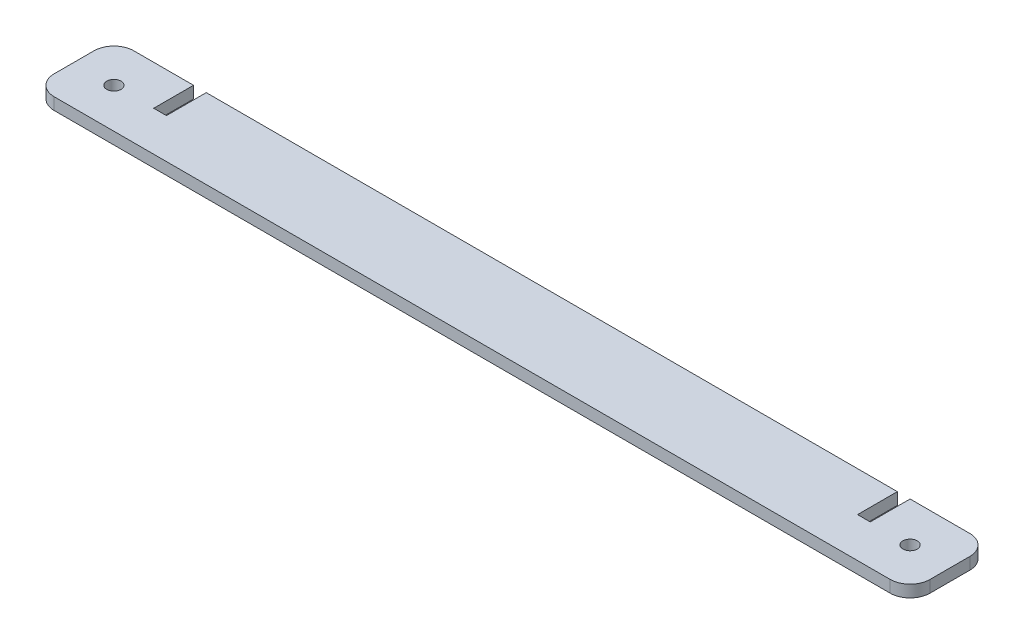
ISO-10303-21;
HEADER;
FILE_DESCRIPTION(('STEP AP214'),'2;1');
FILE_NAME('part.step','',(''),(''),'','','');
FILE_SCHEMA(('AUTOMOTIVE_DESIGN { 1 0 10303 214 1 1 1 1 }'));
ENDSEC;
DATA;
#1=APPLICATION_CONTEXT('core data for automotive mechanical design processes');
#2=APPLICATION_PROTOCOL_DEFINITION('international standard','automotive_design',2000,#1);
#3=PRODUCT_CONTEXT('',#1,'mechanical');
#4=PRODUCT('Part','Part','',(#3));
#5=PRODUCT_RELATED_PRODUCT_CATEGORY('part','',(#4));
#6=PRODUCT_DEFINITION_FORMATION('','',#4);
#7=PRODUCT_DEFINITION_CONTEXT('part definition',#1,'design');
#8=PRODUCT_DEFINITION('design','',#6,#7);
#9=PRODUCT_DEFINITION_SHAPE('','',#8);
#10=(LENGTH_UNIT() NAMED_UNIT(*) SI_UNIT(.MILLI.,.METRE.));
#11=(NAMED_UNIT(*) PLANE_ANGLE_UNIT() SI_UNIT($,.RADIAN.));
#12=(NAMED_UNIT(*) SI_UNIT($,.STERADIAN.) SOLID_ANGLE_UNIT());
#13=UNCERTAINTY_MEASURE_WITH_UNIT(LENGTH_MEASURE(1.E-05),#10,'distance_accuracy_value','');
#14=(GEOMETRIC_REPRESENTATION_CONTEXT(3) GLOBAL_UNCERTAINTY_ASSIGNED_CONTEXT((#13)) GLOBAL_UNIT_ASSIGNED_CONTEXT((#10,
#11,#12)) REPRESENTATION_CONTEXT('',''));
#15=CARTESIAN_POINT('',(0.,0.,0.));
#16=DIRECTION('',(0.,0.,1.));
#17=DIRECTION('',(1.,0.,0.));
#18=AXIS2_PLACEMENT_3D('',#15,#16,#17);
#19=CARTESIAN_POINT('',(105.,3.,-5.));
#20=DIRECTION('',(0.,-1.,0.));
#21=DIRECTION('',(0.,0.,-1.));
#22=AXIS2_PLACEMENT_3D('',#19,#20,#21);
#23=PLANE('',#22);
#24=CARTESIAN_POINT('',(105.,3.,-5.));
#25=DIRECTION('',(0.,1.,0.));
#26=DIRECTION('',(0.,0.,-1.));
#27=AXIS2_PLACEMENT_3D('',#24,#25,#26);
#28=CIRCLE('',#27,5.00000000000001);
#29=CARTESIAN_POINT('',(110.,3.,-5.));
#30=VERTEX_POINT('',#29);
#31=CARTESIAN_POINT('',(105.,3.,-10.));
#32=VERTEX_POINT('',#31);
#33=EDGE_CURVE('E236',#30,#32,#28,.T.);
#34=ORIENTED_EDGE('',*,*,#33,.T.);
#35=DIRECTION('',(-1.,0.,0.));
#36=VECTOR('',#35,1.);
#37=CARTESIAN_POINT('',(90.,3.,-9.99999999999999));
#38=LINE('',#37,#36);
#39=CARTESIAN_POINT('',(90.,3.,-9.99999999999999));
#40=VERTEX_POINT('',#39);
#41=EDGE_CURVE('E124',#32,#40,#38,.T.);
#42=ORIENTED_EDGE('',*,*,#41,.T.);
#43=DIRECTION('',(0.,0.,1.));
#44=VECTOR('',#43,1.);
#45=CARTESIAN_POINT('',(90.,3.,-9.99999999999999));
#46=LINE('',#45,#44);
#47=CARTESIAN_POINT('',(90.,3.,0.));
#48=VERTEX_POINT('',#47);
#49=EDGE_CURVE('E289',#40,#48,#46,.T.);
#50=ORIENTED_EDGE('',*,*,#49,.T.);
#51=DIRECTION('',(-1.,0.,0.));
#52=VECTOR('',#51,1.);
#53=CARTESIAN_POINT('',(90.,3.,0.));
#54=LINE('',#53,#52);
#55=CARTESIAN_POINT('',(86.8,3.,0.));
#56=VERTEX_POINT('',#55);
#57=EDGE_CURVE('E309',#48,#56,#54,.T.);
#58=ORIENTED_EDGE('',*,*,#57,.T.);
#59=DIRECTION('',(0.,0.,-1.));
#60=VECTOR('',#59,1.);
#61=CARTESIAN_POINT('',(86.8,3.,0.));
#62=LINE('',#61,#60);
#63=CARTESIAN_POINT('',(86.8,3.,-9.99999999999999));
#64=VERTEX_POINT('',#63);
#65=EDGE_CURVE('E305',#56,#64,#62,.T.);
#66=ORIENTED_EDGE('',*,*,#65,.T.);
#67=DIRECTION('',(-1.,0.,0.));
#68=VECTOR('',#67,1.);
#69=CARTESIAN_POINT('',(-86.8,3.,-9.99999999999999));
#70=LINE('',#69,#68);
#71=CARTESIAN_POINT('',(-86.8,3.,-9.99999999999999));
#72=VERTEX_POINT('',#71);
#73=EDGE_CURVE('E308',#64,#72,#70,.T.);
#74=ORIENTED_EDGE('',*,*,#73,.T.);
#75=DIRECTION('',(0.,0.,1.));
#76=VECTOR('',#75,1.);
#77=CARTESIAN_POINT('',(-86.8,3.,0.));
#78=LINE('',#77,#76);
#79=CARTESIAN_POINT('',(-86.8,3.,0.));
#80=VERTEX_POINT('',#79);
#81=EDGE_CURVE('E313',#72,#80,#78,.T.);
#82=ORIENTED_EDGE('',*,*,#81,.T.);
#83=DIRECTION('',(-1.,0.,0.));
#84=VECTOR('',#83,1.);
#85=CARTESIAN_POINT('',(-90.,3.,0.));
#86=LINE('',#85,#84);
#87=CARTESIAN_POINT('',(-90.,3.,0.));
#88=VERTEX_POINT('',#87);
#89=EDGE_CURVE('E320',#80,#88,#86,.T.);
#90=ORIENTED_EDGE('',*,*,#89,.T.);
#91=DIRECTION('',(0.,0.,-1.));
#92=VECTOR('',#91,1.);
#93=CARTESIAN_POINT('',(-90.,3.,-9.99999999999999));
#94=LINE('',#93,#92);
#95=CARTESIAN_POINT('',(-90.,3.,-9.99999999999999));
#96=VERTEX_POINT('',#95);
#97=EDGE_CURVE('E323',#88,#96,#94,.T.);
#98=ORIENTED_EDGE('',*,*,#97,.T.);
#99=DIRECTION('',(-1.,0.,0.));
#100=VECTOR('',#99,1.);
#101=CARTESIAN_POINT('',(-105.,3.,-10.));
#102=LINE('',#101,#100);
#103=CARTESIAN_POINT('',(-105.,3.,-10.));
#104=VERTEX_POINT('',#103);
#105=EDGE_CURVE('E326',#96,#104,#102,.T.);
#106=ORIENTED_EDGE('',*,*,#105,.T.);
#107=CARTESIAN_POINT('',(-105.,3.,-5.));
#108=DIRECTION('',(0.,1.,0.));
#109=DIRECTION('',(0.,0.,-1.));
#110=AXIS2_PLACEMENT_3D('',#107,#108,#109);
#111=CIRCLE('',#110,5.00000000000001);
#112=CARTESIAN_POINT('',(-110.,3.,-5.));
#113=VERTEX_POINT('',#112);
#114=EDGE_CURVE('E329',#104,#113,#111,.T.);
#115=ORIENTED_EDGE('',*,*,#114,.T.);
#116=DIRECTION('',(0.,0.,1.));
#117=VECTOR('',#116,1.);
#118=CARTESIAN_POINT('',(-110.,3.,-5.));
#119=LINE('',#118,#117);
#120=CARTESIAN_POINT('',(-110.,3.,5.));
#121=VERTEX_POINT('',#120);
#122=EDGE_CURVE('E332',#113,#121,#119,.T.);
#123=ORIENTED_EDGE('',*,*,#122,.T.);
#124=CARTESIAN_POINT('',(-105.,3.,5.));
#125=DIRECTION('',(0.,1.,0.));
#126=DIRECTION('',(0.,0.,-1.));
#127=AXIS2_PLACEMENT_3D('',#124,#125,#126);
#128=CIRCLE('',#127,5.00000000000001);
#129=CARTESIAN_POINT('',(-105.,3.,10.));
#130=VERTEX_POINT('',#129);
#131=EDGE_CURVE('E167',#121,#130,#128,.T.);
#132=ORIENTED_EDGE('',*,*,#131,.T.);
#133=DIRECTION('',(1.,0.,0.));
#134=VECTOR('',#133,1.);
#135=CARTESIAN_POINT('',(-105.,3.,10.));
#136=LINE('',#135,#134);
#137=CARTESIAN_POINT('',(105.,3.,10.));
#138=VERTEX_POINT('',#137);
#139=EDGE_CURVE('E161',#130,#138,#136,.T.);
#140=ORIENTED_EDGE('',*,*,#139,.T.);
#141=CARTESIAN_POINT('',(105.,3.,5.));
#142=DIRECTION('',(0.,1.,0.));
#143=DIRECTION('',(0.,0.,1.));
#144=AXIS2_PLACEMENT_3D('',#141,#142,#143);
#145=CIRCLE('',#144,5.00000000000001);
#146=CARTESIAN_POINT('',(110.,3.,5.));
#147=VERTEX_POINT('',#146);
#148=EDGE_CURVE('E165',#138,#147,#145,.T.);
#149=ORIENTED_EDGE('',*,*,#148,.T.);
#150=DIRECTION('',(0.,0.,-1.));
#151=VECTOR('',#150,1.);
#152=CARTESIAN_POINT('',(110.,3.,-5.));
#153=LINE('',#152,#151);
#154=EDGE_CURVE('E57',#147,#30,#153,.T.);
#155=ORIENTED_EDGE('',*,*,#154,.T.);
#156=EDGE_LOOP('',(#34,#42,#50,#58,#66,#74,#82,#90,#98,#106,#115,#123,#132,#140,#149,#155));
#157=FACE_BOUND('',#156,.T.);
#158=CARTESIAN_POINT('',(-100.,3.,0.));
#159=DIRECTION('',(0.,1.,0.));
#160=DIRECTION('',(0.,0.,1.));
#161=AXIS2_PLACEMENT_3D('',#158,#159,#160);
#162=CIRCLE('',#161,1.79999999999999);
#163=CARTESIAN_POINT('',(-100.,3.,1.79999999999999));
#164=VERTEX_POINT('',#163);
#165=EDGE_CURVE('E194',#164,#164,#162,.T.);
#166=ORIENTED_EDGE('',*,*,#165,.F.);
#167=EDGE_LOOP('',(#166));
#168=FACE_BOUND('',#167,.T.);
#169=CARTESIAN_POINT('',(100.,3.,0.));
#170=DIRECTION('',(0.,1.,0.));
#171=DIRECTION('',(0.,0.,1.));
#172=AXIS2_PLACEMENT_3D('',#169,#170,#171);
#173=CIRCLE('',#172,1.79999999999999);
#174=CARTESIAN_POINT('',(100.,3.,1.79999999999999));
#175=VERTEX_POINT('',#174);
#176=EDGE_CURVE('E375',#175,#175,#173,.T.);
#177=ORIENTED_EDGE('',*,*,#176,.F.);
#178=EDGE_LOOP('',(#177));
#179=FACE_BOUND('',#178,.T.);
#180=ADVANCED_FACE('F39',(#157,#168,#179),#23,.F.);
#181=CARTESIAN_POINT('',(105.,0.,-5.));
#182=DIRECTION('',(0.,-1.,0.));
#183=DIRECTION('',(0.,0.,-1.));
#184=AXIS2_PLACEMENT_3D('',#181,#182,#183);
#185=PLANE('',#184);
#186=CARTESIAN_POINT('',(-100.,0.,0.));
#187=DIRECTION('',(0.,1.,0.));
#188=DIRECTION('',(0.,0.,1.));
#189=AXIS2_PLACEMENT_3D('',#186,#187,#188);
#190=CIRCLE('',#189,1.79999999999999);
#191=CARTESIAN_POINT('',(-100.,0.,1.79999999999999));
#192=VERTEX_POINT('',#191);
#193=EDGE_CURVE('E382',#192,#192,#190,.T.);
#194=ORIENTED_EDGE('',*,*,#193,.T.);
#195=EDGE_LOOP('',(#194));
#196=FACE_BOUND('',#195,.T.);
#197=CARTESIAN_POINT('',(105.,0.,-5.));
#198=DIRECTION('',(0.,1.,0.));
#199=DIRECTION('',(0.,0.,-1.));
#200=AXIS2_PLACEMENT_3D('',#197,#198,#199);
#201=CIRCLE('',#200,5.00000000000001);
#202=CARTESIAN_POINT('',(110.,0.,-5.));
#203=VERTEX_POINT('',#202);
#204=CARTESIAN_POINT('',(105.,0.,-10.));
#205=VERTEX_POINT('',#204);
#206=EDGE_CURVE('E189',#203,#205,#201,.T.);
#207=ORIENTED_EDGE('',*,*,#206,.F.);
#208=DIRECTION('',(0.,0.,-1.));
#209=VECTOR('',#208,1.);
#210=CARTESIAN_POINT('',(110.,0.,-5.));
#211=LINE('',#210,#209);
#212=CARTESIAN_POINT('',(110.,0.,5.));
#213=VERTEX_POINT('',#212);
#214=EDGE_CURVE('E116',#213,#203,#211,.T.);
#215=ORIENTED_EDGE('',*,*,#214,.F.);
#216=CARTESIAN_POINT('',(105.,0.,5.));
#217=DIRECTION('',(0.,1.,0.));
#218=DIRECTION('',(0.,0.,1.));
#219=AXIS2_PLACEMENT_3D('',#216,#217,#218);
#220=CIRCLE('',#219,5.00000000000001);
#221=CARTESIAN_POINT('',(105.,0.,10.));
#222=VERTEX_POINT('',#221);
#223=EDGE_CURVE('E110',#222,#213,#220,.T.);
#224=ORIENTED_EDGE('',*,*,#223,.F.);
#225=DIRECTION('',(1.,0.,0.));
#226=VECTOR('',#225,1.);
#227=CARTESIAN_POINT('',(-105.,0.,10.));
#228=LINE('',#227,#226);
#229=CARTESIAN_POINT('',(-105.,0.,10.));
#230=VERTEX_POINT('',#229);
#231=EDGE_CURVE('E176',#230,#222,#228,.T.);
#232=ORIENTED_EDGE('',*,*,#231,.F.);
#233=CARTESIAN_POINT('',(-105.,0.,5.));
#234=DIRECTION('',(0.,1.,0.));
#235=DIRECTION('',(0.,0.,-1.));
#236=AXIS2_PLACEMENT_3D('',#233,#234,#235);
#237=CIRCLE('',#236,5.00000000000001);
#238=CARTESIAN_POINT('',(-110.,0.,5.));
#239=VERTEX_POINT('',#238);
#240=EDGE_CURVE('E227',#239,#230,#237,.T.);
#241=ORIENTED_EDGE('',*,*,#240,.F.);
#242=DIRECTION('',(0.,0.,1.));
#243=VECTOR('',#242,1.);
#244=CARTESIAN_POINT('',(-110.,0.,-5.));
#245=LINE('',#244,#243);
#246=CARTESIAN_POINT('',(-110.,0.,-5.));
#247=VERTEX_POINT('',#246);
#248=EDGE_CURVE('E224',#247,#239,#245,.T.);
#249=ORIENTED_EDGE('',*,*,#248,.F.);
#250=CARTESIAN_POINT('',(-105.,0.,-5.));
#251=DIRECTION('',(0.,1.,0.));
#252=DIRECTION('',(0.,0.,-1.));
#253=AXIS2_PLACEMENT_3D('',#250,#251,#252);
#254=CIRCLE('',#253,5.00000000000001);
#255=CARTESIAN_POINT('',(-105.,0.,-10.));
#256=VERTEX_POINT('',#255);
#257=EDGE_CURVE('E221',#256,#247,#254,.T.);
#258=ORIENTED_EDGE('',*,*,#257,.F.);
#259=DIRECTION('',(-1.,0.,0.));
#260=VECTOR('',#259,1.);
#261=CARTESIAN_POINT('',(-105.,0.,-10.));
#262=LINE('',#261,#260);
#263=CARTESIAN_POINT('',(-90.,0.,-9.99999999999999));
#264=VERTEX_POINT('',#263);
#265=EDGE_CURVE('E218',#264,#256,#262,.T.);
#266=ORIENTED_EDGE('',*,*,#265,.F.);
#267=DIRECTION('',(0.,0.,-1.));
#268=VECTOR('',#267,1.);
#269=CARTESIAN_POINT('',(-90.,0.,-9.99999999999999));
#270=LINE('',#269,#268);
#271=CARTESIAN_POINT('',(-90.,0.,0.));
#272=VERTEX_POINT('',#271);
#273=EDGE_CURVE('E215',#272,#264,#270,.T.);
#274=ORIENTED_EDGE('',*,*,#273,.F.);
#275=DIRECTION('',(-1.,0.,0.));
#276=VECTOR('',#275,1.);
#277=CARTESIAN_POINT('',(-90.,0.,0.));
#278=LINE('',#277,#276);
#279=CARTESIAN_POINT('',(-86.8,0.,0.));
#280=VERTEX_POINT('',#279);
#281=EDGE_CURVE('E212',#280,#272,#278,.T.);
#282=ORIENTED_EDGE('',*,*,#281,.F.);
#283=DIRECTION('',(0.,0.,1.));
#284=VECTOR('',#283,1.);
#285=CARTESIAN_POINT('',(-86.8,0.,0.));
#286=LINE('',#285,#284);
#287=CARTESIAN_POINT('',(-86.8,0.,-9.99999999999999));
#288=VERTEX_POINT('',#287);
#289=EDGE_CURVE('E209',#288,#280,#286,.T.);
#290=ORIENTED_EDGE('',*,*,#289,.F.);
#291=DIRECTION('',(-1.,0.,0.));
#292=VECTOR('',#291,1.);
#293=CARTESIAN_POINT('',(-86.8,0.,-9.99999999999999));
#294=LINE('',#293,#292);
#295=CARTESIAN_POINT('',(86.8,0.,-9.99999999999999));
#296=VERTEX_POINT('',#295);
#297=EDGE_CURVE('E206',#296,#288,#294,.T.);
#298=ORIENTED_EDGE('',*,*,#297,.F.);
#299=DIRECTION('',(0.,0.,-1.));
#300=VECTOR('',#299,1.);
#301=CARTESIAN_POINT('',(86.8,0.,0.));
#302=LINE('',#301,#300);
#303=CARTESIAN_POINT('',(86.8,0.,0.));
#304=VERTEX_POINT('',#303);
#305=EDGE_CURVE('E203',#304,#296,#302,.T.);
#306=ORIENTED_EDGE('',*,*,#305,.F.);
#307=DIRECTION('',(-1.,0.,0.));
#308=VECTOR('',#307,1.);
#309=CARTESIAN_POINT('',(90.,0.,0.));
#310=LINE('',#309,#308);
#311=CARTESIAN_POINT('',(90.,0.,0.));
#312=VERTEX_POINT('',#311);
#313=EDGE_CURVE('E200',#312,#304,#310,.T.);
#314=ORIENTED_EDGE('',*,*,#313,.F.);
#315=DIRECTION('',(0.,0.,1.));
#316=VECTOR('',#315,1.);
#317=CARTESIAN_POINT('',(90.,0.,-9.99999999999999));
#318=LINE('',#317,#316);
#319=CARTESIAN_POINT('',(90.,0.,-9.99999999999999));
#320=VERTEX_POINT('',#319);
#321=EDGE_CURVE('E197',#320,#312,#318,.T.);
#322=ORIENTED_EDGE('',*,*,#321,.F.);
#323=DIRECTION('',(-1.,0.,0.));
#324=VECTOR('',#323,1.);
#325=CARTESIAN_POINT('',(90.,0.,-9.99999999999999));
#326=LINE('',#325,#324);
#327=EDGE_CURVE('E193',#205,#320,#326,.T.);
#328=ORIENTED_EDGE('',*,*,#327,.F.);
#329=EDGE_LOOP('',(#207,#215,#224,#232,#241,#249,#258,#266,#274,#282,#290,#298,#306,#314,#322,#328));
#330=FACE_BOUND('',#329,.T.);
#331=CARTESIAN_POINT('',(100.,0.,0.));
#332=DIRECTION('',(0.,1.,0.));
#333=DIRECTION('',(0.,0.,1.));
#334=AXIS2_PLACEMENT_3D('',#331,#332,#333);
#335=CIRCLE('',#334,1.79999999999999);
#336=CARTESIAN_POINT('',(100.,0.,1.79999999999999));
#337=VERTEX_POINT('',#336);
#338=EDGE_CURVE('E378',#337,#337,#335,.T.);
#339=ORIENTED_EDGE('',*,*,#338,.T.);
#340=EDGE_LOOP('',(#339));
#341=FACE_BOUND('',#340,.T.);
#342=ADVANCED_FACE('F293',(#196,#330,#341),#185,.T.);
#343=CARTESIAN_POINT('',(105.,3.,-5.));
#344=DIRECTION('',(0.,-1.,0.));
#345=DIRECTION('',(0.,0.,-1.));
#346=AXIS2_PLACEMENT_3D('',#343,#344,#345);
#347=CYLINDRICAL_SURFACE('',#346,5.00000000000001);
#348=ORIENTED_EDGE('',*,*,#206,.T.);
#349=DIRECTION('',(0.,-1.,0.));
#350=VECTOR('',#349,1.);
#351=CARTESIAN_POINT('',(105.,3.,-10.));
#352=LINE('',#351,#350);
#353=EDGE_CURVE('E11',#32,#205,#352,.T.);
#354=ORIENTED_EDGE('',*,*,#353,.F.);
#355=ORIENTED_EDGE('',*,*,#33,.F.);
#356=DIRECTION('',(0.,-1.,0.));
#357=VECTOR('',#356,1.);
#358=CARTESIAN_POINT('',(110.,3.,-5.));
#359=LINE('',#358,#357);
#360=EDGE_CURVE('E185',#30,#203,#359,.T.);
#361=ORIENTED_EDGE('',*,*,#360,.T.);
#362=EDGE_LOOP('',(#348,#354,#355,#361));
#363=FACE_BOUND('',#362,.T.);
#364=ADVANCED_FACE('F41',(#363),#347,.T.);
#365=CARTESIAN_POINT('',(90.,3.,-9.99999999999999));
#366=DIRECTION('',(0.,0.,1.));
#367=DIRECTION('',(1.,0.,0.));
#368=AXIS2_PLACEMENT_3D('',#365,#366,#367);
#369=PLANE('',#368);
#370=ORIENTED_EDGE('',*,*,#327,.T.);
#371=DIRECTION('',(0.,-1.,0.));
#372=VECTOR('',#371,1.);
#373=CARTESIAN_POINT('',(90.,3.,-9.99999999999999));
#374=LINE('',#373,#372);
#375=EDGE_CURVE('E49',#40,#320,#374,.T.);
#376=ORIENTED_EDGE('',*,*,#375,.F.);
#377=ORIENTED_EDGE('',*,*,#41,.F.);
#378=ORIENTED_EDGE('',*,*,#353,.T.);
#379=EDGE_LOOP('',(#370,#376,#377,#378));
#380=FACE_BOUND('',#379,.T.);
#381=ADVANCED_FACE('F522',(#380),#369,.F.);
#382=CARTESIAN_POINT('',(90.,3.,-9.99999999999999));
#383=DIRECTION('',(1.,0.,0.));
#384=DIRECTION('',(0.,0.,-1.));
#385=AXIS2_PLACEMENT_3D('',#382,#383,#384);
#386=PLANE('',#385);
#387=ORIENTED_EDGE('',*,*,#321,.T.);
#388=DIRECTION('',(0.,-1.,0.));
#389=VECTOR('',#388,1.);
#390=CARTESIAN_POINT('',(90.,3.,0.));
#391=LINE('',#390,#389);
#392=EDGE_CURVE('E279',#48,#312,#391,.T.);
#393=ORIENTED_EDGE('',*,*,#392,.F.);
#394=ORIENTED_EDGE('',*,*,#49,.F.);
#395=ORIENTED_EDGE('',*,*,#375,.T.);
#396=EDGE_LOOP('',(#387,#393,#394,#395));
#397=FACE_BOUND('',#396,.T.);
#398=ADVANCED_FACE('F287',(#397),#386,.F.);
#399=CARTESIAN_POINT('',(90.,3.,0.));
#400=DIRECTION('',(0.,0.,1.));
#401=DIRECTION('',(1.,0.,0.));
#402=AXIS2_PLACEMENT_3D('',#399,#400,#401);
#403=PLANE('',#402);
#404=ORIENTED_EDGE('',*,*,#313,.T.);
#405=DIRECTION('',(0.,-1.,0.));
#406=VECTOR('',#405,1.);
#407=CARTESIAN_POINT('',(86.8,3.,0.));
#408=LINE('',#407,#406);
#409=EDGE_CURVE('E275',#56,#304,#408,.T.);
#410=ORIENTED_EDGE('',*,*,#409,.F.);
#411=ORIENTED_EDGE('',*,*,#57,.F.);
#412=ORIENTED_EDGE('',*,*,#392,.T.);
#413=EDGE_LOOP('',(#404,#410,#411,#412));
#414=FACE_BOUND('',#413,.T.);
#415=ADVANCED_FACE('F299',(#414),#403,.F.);
#416=CARTESIAN_POINT('',(86.8,3.,0.));
#417=DIRECTION('',(-1.,0.,0.));
#418=DIRECTION('',(0.,0.,1.));
#419=AXIS2_PLACEMENT_3D('',#416,#417,#418);
#420=PLANE('',#419);
#421=ORIENTED_EDGE('',*,*,#305,.T.);
#422=DIRECTION('',(0.,-1.,0.));
#423=VECTOR('',#422,1.);
#424=CARTESIAN_POINT('',(86.8,3.,-9.99999999999999));
#425=LINE('',#424,#423);
#426=EDGE_CURVE('E271',#64,#296,#425,.T.);
#427=ORIENTED_EDGE('',*,*,#426,.F.);
#428=ORIENTED_EDGE('',*,*,#65,.F.);
#429=ORIENTED_EDGE('',*,*,#409,.T.);
#430=EDGE_LOOP('',(#421,#427,#428,#429));
#431=FACE_BOUND('',#430,.T.);
#432=ADVANCED_FACE('F303',(#431),#420,.F.);
#433=CARTESIAN_POINT('',(-86.8,3.,-9.99999999999999));
#434=DIRECTION('',(0.,0.,1.));
#435=DIRECTION('',(1.,0.,0.));
#436=AXIS2_PLACEMENT_3D('',#433,#434,#435);
#437=PLANE('',#436);
#438=ORIENTED_EDGE('',*,*,#297,.T.);
#439=DIRECTION('',(0.,-1.,0.));
#440=VECTOR('',#439,1.);
#441=CARTESIAN_POINT('',(-86.8,3.,-9.99999999999999));
#442=LINE('',#441,#440);
#443=EDGE_CURVE('E267',#72,#288,#442,.T.);
#444=ORIENTED_EDGE('',*,*,#443,.F.);
#445=ORIENTED_EDGE('',*,*,#73,.F.);
#446=ORIENTED_EDGE('',*,*,#426,.T.);
#447=EDGE_LOOP('',(#438,#444,#445,#446));
#448=FACE_BOUND('',#447,.T.);
#449=ADVANCED_FACE('F487',(#448),#437,.F.);
#450=CARTESIAN_POINT('',(-86.8,3.,0.));
#451=DIRECTION('',(1.,0.,0.));
#452=DIRECTION('',(0.,0.,-1.));
#453=AXIS2_PLACEMENT_3D('',#450,#451,#452);
#454=PLANE('',#453);
#455=ORIENTED_EDGE('',*,*,#289,.T.);
#456=DIRECTION('',(0.,-1.,0.));
#457=VECTOR('',#456,1.);
#458=CARTESIAN_POINT('',(-86.8,3.,0.));
#459=LINE('',#458,#457);
#460=EDGE_CURVE('E263',#80,#280,#459,.T.);
#461=ORIENTED_EDGE('',*,*,#460,.F.);
#462=ORIENTED_EDGE('',*,*,#81,.F.);
#463=ORIENTED_EDGE('',*,*,#443,.T.);
#464=EDGE_LOOP('',(#455,#461,#462,#463));
#465=FACE_BOUND('',#464,.T.);
#466=ADVANCED_FACE('F477',(#465),#454,.F.);
#467=CARTESIAN_POINT('',(-90.,3.,0.));
#468=DIRECTION('',(0.,0.,1.));
#469=DIRECTION('',(1.,0.,0.));
#470=AXIS2_PLACEMENT_3D('',#467,#468,#469);
#471=PLANE('',#470);
#472=ORIENTED_EDGE('',*,*,#281,.T.);
#473=DIRECTION('',(0.,-1.,0.));
#474=VECTOR('',#473,1.);
#475=CARTESIAN_POINT('',(-90.,3.,0.));
#476=LINE('',#475,#474);
#477=EDGE_CURVE('E259',#88,#272,#476,.T.);
#478=ORIENTED_EDGE('',*,*,#477,.F.);
#479=ORIENTED_EDGE('',*,*,#89,.F.);
#480=ORIENTED_EDGE('',*,*,#460,.T.);
#481=EDGE_LOOP('',(#472,#478,#479,#480));
#482=FACE_BOUND('',#481,.T.);
#483=ADVANCED_FACE('F467',(#482),#471,.F.);
#484=CARTESIAN_POINT('',(-90.,3.,-9.99999999999999));
#485=DIRECTION('',(-1.,0.,0.));
#486=DIRECTION('',(0.,0.,1.));
#487=AXIS2_PLACEMENT_3D('',#484,#485,#486);
#488=PLANE('',#487);
#489=ORIENTED_EDGE('',*,*,#273,.T.);
#490=DIRECTION('',(0.,-1.,0.));
#491=VECTOR('',#490,1.);
#492=CARTESIAN_POINT('',(-90.,3.,-9.99999999999999));
#493=LINE('',#492,#491);
#494=EDGE_CURVE('E255',#96,#264,#493,.T.);
#495=ORIENTED_EDGE('',*,*,#494,.F.);
#496=ORIENTED_EDGE('',*,*,#97,.F.);
#497=ORIENTED_EDGE('',*,*,#477,.T.);
#498=EDGE_LOOP('',(#489,#495,#496,#497));
#499=FACE_BOUND('',#498,.T.);
#500=ADVANCED_FACE('F457',(#499),#488,.F.);
#501=CARTESIAN_POINT('',(-105.,3.,-10.));
#502=DIRECTION('',(0.,0.,1.));
#503=DIRECTION('',(1.,0.,0.));
#504=AXIS2_PLACEMENT_3D('',#501,#502,#503);
#505=PLANE('',#504);
#506=ORIENTED_EDGE('',*,*,#265,.T.);
#507=DIRECTION('',(0.,-1.,0.));
#508=VECTOR('',#507,1.);
#509=CARTESIAN_POINT('',(-105.,3.,-10.));
#510=LINE('',#509,#508);
#511=EDGE_CURVE('E251',#104,#256,#510,.T.);
#512=ORIENTED_EDGE('',*,*,#511,.F.);
#513=ORIENTED_EDGE('',*,*,#105,.F.);
#514=ORIENTED_EDGE('',*,*,#494,.T.);
#515=EDGE_LOOP('',(#506,#512,#513,#514));
#516=FACE_BOUND('',#515,.T.);
#517=ADVANCED_FACE('F447',(#516),#505,.F.);
#518=CARTESIAN_POINT('',(-105.,3.,-5.));
#519=DIRECTION('',(0.,-1.,0.));
#520=DIRECTION('',(0.,0.,-1.));
#521=AXIS2_PLACEMENT_3D('',#518,#519,#520);
#522=CYLINDRICAL_SURFACE('',#521,5.00000000000001);
#523=ORIENTED_EDGE('',*,*,#257,.T.);
#524=DIRECTION('',(0.,-1.,0.));
#525=VECTOR('',#524,1.);
#526=CARTESIAN_POINT('',(-110.,3.,-5.));
#527=LINE('',#526,#525);
#528=EDGE_CURVE('E247',#113,#247,#527,.T.);
#529=ORIENTED_EDGE('',*,*,#528,.F.);
#530=ORIENTED_EDGE('',*,*,#114,.F.);
#531=ORIENTED_EDGE('',*,*,#511,.T.);
#532=EDGE_LOOP('',(#523,#529,#530,#531));
#533=FACE_BOUND('',#532,.T.);
#534=ADVANCED_FACE('F438',(#533),#522,.T.);
#535=CARTESIAN_POINT('',(-110.,3.,-5.));
#536=DIRECTION('',(1.,0.,0.));
#537=DIRECTION('',(0.,0.,-1.));
#538=AXIS2_PLACEMENT_3D('',#535,#536,#537);
#539=PLANE('',#538);
#540=ORIENTED_EDGE('',*,*,#248,.T.);
#541=DIRECTION('',(0.,-1.,0.));
#542=VECTOR('',#541,1.);
#543=CARTESIAN_POINT('',(-110.,3.,5.));
#544=LINE('',#543,#542);
#545=EDGE_CURVE('E243',#121,#239,#544,.T.);
#546=ORIENTED_EDGE('',*,*,#545,.F.);
#547=ORIENTED_EDGE('',*,*,#122,.F.);
#548=ORIENTED_EDGE('',*,*,#528,.T.);
#549=EDGE_LOOP('',(#540,#546,#547,#548));
#550=FACE_BOUND('',#549,.T.);
#551=ADVANCED_FACE('F340',(#550),#539,.F.);
#552=CARTESIAN_POINT('',(-105.,3.,5.));
#553=DIRECTION('',(0.,-1.,0.));
#554=DIRECTION('',(0.,0.,-1.));
#555=AXIS2_PLACEMENT_3D('',#552,#553,#554);
#556=CYLINDRICAL_SURFACE('',#555,5.00000000000001);
#557=ORIENTED_EDGE('',*,*,#240,.T.);
#558=DIRECTION('',(0.,-1.,0.));
#559=VECTOR('',#558,1.);
#560=CARTESIAN_POINT('',(-105.,3.,10.));
#561=LINE('',#560,#559);
#562=EDGE_CURVE('E178',#130,#230,#561,.T.);
#563=ORIENTED_EDGE('',*,*,#562,.F.);
#564=ORIENTED_EDGE('',*,*,#131,.F.);
#565=ORIENTED_EDGE('',*,*,#545,.T.);
#566=EDGE_LOOP('',(#557,#563,#564,#565));
#567=FACE_BOUND('',#566,.T.);
#568=ADVANCED_FACE('F344',(#567),#556,.T.);
#569=CARTESIAN_POINT('',(-105.,3.,10.));
#570=DIRECTION('',(0.,0.,-1.));
#571=DIRECTION('',(-1.,0.,0.));
#572=AXIS2_PLACEMENT_3D('',#569,#570,#571);
#573=PLANE('',#572);
#574=ORIENTED_EDGE('',*,*,#231,.T.);
#575=DIRECTION('',(0.,-1.,0.));
#576=VECTOR('',#575,1.);
#577=CARTESIAN_POINT('',(105.,3.,10.));
#578=LINE('',#577,#576);
#579=EDGE_CURVE('E173',#138,#222,#578,.T.);
#580=ORIENTED_EDGE('',*,*,#579,.F.);
#581=ORIENTED_EDGE('',*,*,#139,.F.);
#582=ORIENTED_EDGE('',*,*,#562,.T.);
#583=EDGE_LOOP('',(#574,#580,#581,#582));
#584=FACE_BOUND('',#583,.T.);
#585=ADVANCED_FACE('F174',(#584),#573,.F.);
#586=CARTESIAN_POINT('',(105.,3.,5.));
#587=DIRECTION('',(0.,-1.,0.));
#588=DIRECTION('',(0.,0.,-1.));
#589=AXIS2_PLACEMENT_3D('',#586,#587,#588);
#590=CYLINDRICAL_SURFACE('',#589,5.00000000000001);
#591=ORIENTED_EDGE('',*,*,#223,.T.);
#592=DIRECTION('',(0.,-1.,0.));
#593=VECTOR('',#592,1.);
#594=CARTESIAN_POINT('',(110.,3.,5.));
#595=LINE('',#594,#593);
#596=EDGE_CURVE('E179',#147,#213,#595,.T.);
#597=ORIENTED_EDGE('',*,*,#596,.F.);
#598=ORIENTED_EDGE('',*,*,#148,.F.);
#599=ORIENTED_EDGE('',*,*,#579,.T.);
#600=EDGE_LOOP('',(#591,#597,#598,#599));
#601=FACE_BOUND('',#600,.T.);
#602=ADVANCED_FACE('F181',(#601),#590,.T.);
#603=CARTESIAN_POINT('',(110.,3.,-5.));
#604=DIRECTION('',(-1.,0.,0.));
#605=DIRECTION('',(0.,0.,1.));
#606=AXIS2_PLACEMENT_3D('',#603,#604,#605);
#607=PLANE('',#606);
#608=ORIENTED_EDGE('',*,*,#214,.T.);
#609=ORIENTED_EDGE('',*,*,#360,.F.);
#610=ORIENTED_EDGE('',*,*,#154,.F.);
#611=ORIENTED_EDGE('',*,*,#596,.T.);
#612=EDGE_LOOP('',(#608,#609,#610,#611));
#613=FACE_BOUND('',#612,.T.);
#614=ADVANCED_FACE('F348',(#613),#607,.F.);
#615=CARTESIAN_POINT('',(-100.,3.,0.));
#616=DIRECTION('',(0.,-1.,0.));
#617=DIRECTION('',(0.,0.,-1.));
#618=AXIS2_PLACEMENT_3D('',#615,#616,#617);
#619=CYLINDRICAL_SURFACE('',#618,1.79999999999999);
#620=ORIENTED_EDGE('',*,*,#165,.T.);
#621=EDGE_LOOP('',(#620));
#622=FACE_BOUND('',#621,.T.);
#623=ORIENTED_EDGE('',*,*,#193,.F.);
#624=EDGE_LOOP('',(#623));
#625=FACE_BOUND('',#624,.T.);
#626=ADVANCED_FACE('F350',(#622,#625),#619,.F.);
#627=CARTESIAN_POINT('',(100.,3.,0.));
#628=DIRECTION('',(0.,-1.,0.));
#629=DIRECTION('',(0.,0.,-1.));
#630=AXIS2_PLACEMENT_3D('',#627,#628,#629);
#631=CYLINDRICAL_SURFACE('',#630,1.79999999999999);
#632=ORIENTED_EDGE('',*,*,#176,.T.);
#633=EDGE_LOOP('',(#632));
#634=FACE_BOUND('',#633,.T.);
#635=ORIENTED_EDGE('',*,*,#338,.F.);
#636=EDGE_LOOP('',(#635));
#637=FACE_BOUND('',#636,.T.);
#638=ADVANCED_FACE('F356',(#634,#637),#631,.F.);
#639=CLOSED_SHELL('',(#180,#342,#364,#381,#398,#415,#432,#449,#466,#483,#500,#517,#534,#551,
#568,#585,#602,#614,#626,#638));
#640=MANIFOLD_SOLID_BREP('B2',#639);
#641=ADVANCED_BREP_SHAPE_REPRESENTATION('',(#18,#640),#14);
#642=SHAPE_DEFINITION_REPRESENTATION(#9,#641);
ENDSEC;
END-ISO-10303-21;
